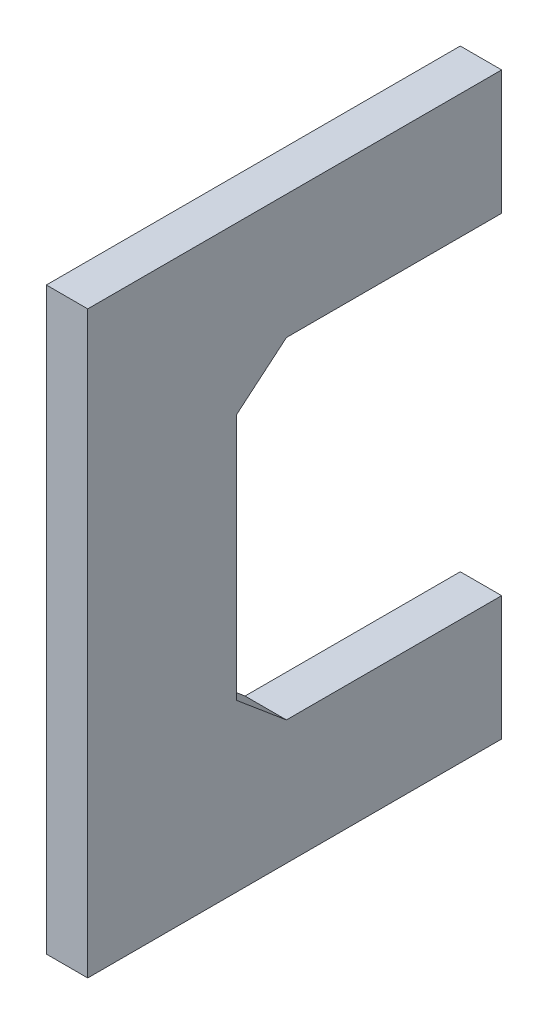
ISO-10303-21;
HEADER;
FILE_DESCRIPTION(('STEP AP214'),'2;1');
FILE_NAME('part.step','',(''),(''),'','','');
FILE_SCHEMA(('AUTOMOTIVE_DESIGN { 1 0 10303 214 1 1 1 1 }'));
ENDSEC;
DATA;
#1=APPLICATION_CONTEXT('core data for automotive mechanical design processes');
#2=APPLICATION_PROTOCOL_DEFINITION('international standard','automotive_design',2000,#1);
#3=PRODUCT_CONTEXT('',#1,'mechanical');
#4=PRODUCT('Part','Part','',(#3));
#5=PRODUCT_RELATED_PRODUCT_CATEGORY('part','',(#4));
#6=PRODUCT_DEFINITION_FORMATION('','',#4);
#7=PRODUCT_DEFINITION_CONTEXT('part definition',#1,'design');
#8=PRODUCT_DEFINITION('design','',#6,#7);
#9=PRODUCT_DEFINITION_SHAPE('','',#8);
#10=(LENGTH_UNIT() NAMED_UNIT(*) SI_UNIT(.MILLI.,.METRE.));
#11=(NAMED_UNIT(*) PLANE_ANGLE_UNIT() SI_UNIT($,.RADIAN.));
#12=(NAMED_UNIT(*) SI_UNIT($,.STERADIAN.) SOLID_ANGLE_UNIT());
#13=UNCERTAINTY_MEASURE_WITH_UNIT(LENGTH_MEASURE(1.E-05),#10,'distance_accuracy_value','');
#14=(GEOMETRIC_REPRESENTATION_CONTEXT(3) GLOBAL_UNCERTAINTY_ASSIGNED_CONTEXT((#13)) GLOBAL_UNIT_ASSIGNED_CONTEXT((#10,
#11,#12)) REPRESENTATION_CONTEXT('',''));
#15=CARTESIAN_POINT('',(0.,0.,0.));
#16=DIRECTION('',(0.,0.,1.));
#17=DIRECTION('',(1.,0.,0.));
#18=AXIS2_PLACEMENT_3D('',#15,#16,#17);
#19=CARTESIAN_POINT('',(5.,0.,-50.));
#20=DIRECTION('',(0.,0.,1.));
#21=DIRECTION('',(1.,0.,0.));
#22=AXIS2_PLACEMENT_3D('',#19,#20,#21);
#23=PLANE('',#22);
#24=DIRECTION('',(0.,1.,0.));
#25=VECTOR('',#24,1.);
#26=CARTESIAN_POINT('',(5.,0.,-50.));
#27=LINE('',#26,#25);
#28=CARTESIAN_POINT('',(5.,55.,-50.));
#29=VERTEX_POINT('',#28);
#30=CARTESIAN_POINT('',(5.,70.,-50.));
#31=VERTEX_POINT('',#30);
#32=EDGE_CURVE('E197',#29,#31,#27,.T.);
#33=ORIENTED_EDGE('',*,*,#32,.F.);
#34=DIRECTION('',(1.,0.,0.));
#35=VECTOR('',#34,1.);
#36=CARTESIAN_POINT('',(0.,55.,-50.));
#37=LINE('',#36,#35);
#38=CARTESIAN_POINT('',(0.,55.,-50.));
#39=VERTEX_POINT('',#38);
#40=EDGE_CURVE('E176',#39,#29,#37,.T.);
#41=ORIENTED_EDGE('',*,*,#40,.F.);
#42=DIRECTION('',(0.,1.,0.));
#43=VECTOR('',#42,1.);
#44=CARTESIAN_POINT('',(0.,0.,-50.));
#45=LINE('',#44,#43);
#46=CARTESIAN_POINT('',(0.,70.,-50.));
#47=VERTEX_POINT('',#46);
#48=EDGE_CURVE('E147',#39,#47,#45,.T.);
#49=ORIENTED_EDGE('',*,*,#48,.T.);
#50=DIRECTION('',(-1.,0.,0.));
#51=VECTOR('',#50,1.);
#52=CARTESIAN_POINT('',(5.,70.,-50.));
#53=LINE('',#52,#51);
#54=EDGE_CURVE('E219',#31,#47,#53,.T.);
#55=ORIENTED_EDGE('',*,*,#54,.F.);
#56=EDGE_LOOP('',(#33,#41,#49,#55));
#57=FACE_BOUND('',#56,.T.);
#58=ADVANCED_FACE('F38',(#57),#23,.F.);
#59=CARTESIAN_POINT('',(5.,0.,0.));
#60=DIRECTION('',(0.,0.,-1.));
#61=DIRECTION('',(-1.,0.,0.));
#62=AXIS2_PLACEMENT_3D('',#59,#60,#61);
#63=PLANE('',#62);
#64=DIRECTION('',(0.,-1.,0.));
#65=VECTOR('',#64,1.);
#66=CARTESIAN_POINT('',(0.,0.,0.));
#67=LINE('',#66,#65);
#68=CARTESIAN_POINT('',(0.,70.,0.));
#69=VERTEX_POINT('',#68);
#70=CARTESIAN_POINT('',(0.,0.,0.));
#71=VERTEX_POINT('',#70);
#72=EDGE_CURVE('E179',#69,#71,#67,.T.);
#73=ORIENTED_EDGE('',*,*,#72,.T.);
#74=DIRECTION('',(-1.,0.,0.));
#75=VECTOR('',#74,1.);
#76=CARTESIAN_POINT('',(5.,0.,0.));
#77=LINE('',#76,#75);
#78=CARTESIAN_POINT('',(5.,0.,0.));
#79=VERTEX_POINT('',#78);
#80=EDGE_CURVE('E11',#79,#71,#77,.T.);
#81=ORIENTED_EDGE('',*,*,#80,.F.);
#82=DIRECTION('',(0.,-1.,0.));
#83=VECTOR('',#82,1.);
#84=CARTESIAN_POINT('',(5.,0.,0.));
#85=LINE('',#84,#83);
#86=CARTESIAN_POINT('',(5.,70.,0.));
#87=VERTEX_POINT('',#86);
#88=EDGE_CURVE('E192',#87,#79,#85,.T.);
#89=ORIENTED_EDGE('',*,*,#88,.F.);
#90=DIRECTION('',(-1.,0.,0.));
#91=VECTOR('',#90,1.);
#92=CARTESIAN_POINT('',(5.,70.,0.));
#93=LINE('',#92,#91);
#94=EDGE_CURVE('E204',#87,#69,#93,.T.);
#95=ORIENTED_EDGE('',*,*,#94,.T.);
#96=EDGE_LOOP('',(#73,#81,#89,#95));
#97=FACE_BOUND('',#96,.T.);
#98=ADVANCED_FACE('F40',(#97),#63,.F.);
#99=CARTESIAN_POINT('',(5.,0.,0.));
#100=DIRECTION('',(0.,1.,0.));
#101=DIRECTION('',(0.,0.,1.));
#102=AXIS2_PLACEMENT_3D('',#99,#100,#101);
#103=PLANE('',#102);
#104=DIRECTION('',(0.,0.,-1.));
#105=VECTOR('',#104,1.);
#106=CARTESIAN_POINT('',(0.,0.,0.));
#107=LINE('',#106,#105);
#108=CARTESIAN_POINT('',(0.,0.,-50.));
#109=VERTEX_POINT('',#108);
#110=EDGE_CURVE('E208',#71,#109,#107,.T.);
#111=ORIENTED_EDGE('',*,*,#110,.T.);
#112=DIRECTION('',(-1.,0.,0.));
#113=VECTOR('',#112,1.);
#114=CARTESIAN_POINT('',(5.,0.,-50.));
#115=LINE('',#114,#113);
#116=CARTESIAN_POINT('',(5.,0.,-50.));
#117=VERTEX_POINT('',#116);
#118=EDGE_CURVE('E47',#117,#109,#115,.T.);
#119=ORIENTED_EDGE('',*,*,#118,.F.);
#120=DIRECTION('',(0.,0.,-1.));
#121=VECTOR('',#120,1.);
#122=CARTESIAN_POINT('',(5.,0.,0.));
#123=LINE('',#122,#121);
#124=EDGE_CURVE('E91',#79,#117,#123,.T.);
#125=ORIENTED_EDGE('',*,*,#124,.F.);
#126=ORIENTED_EDGE('',*,*,#80,.T.);
#127=EDGE_LOOP('',(#111,#119,#125,#126));
#128=FACE_BOUND('',#127,.T.);
#129=ADVANCED_FACE('F238',(#128),#103,.F.);
#130=CARTESIAN_POINT('',(0.,15.,-50.));
#131=VERTEX_POINT('',#130);
#132=EDGE_CURVE('E211',#109,#131,#45,.T.);
#133=ORIENTED_EDGE('',*,*,#132,.T.);
#134=DIRECTION('',(1.,0.,0.));
#135=VECTOR('',#134,1.);
#136=CARTESIAN_POINT('',(0.,15.,-50.));
#137=LINE('',#136,#135);
#138=CARTESIAN_POINT('',(5.,15.,-50.));
#139=VERTEX_POINT('',#138);
#140=EDGE_CURVE('E180',#131,#139,#137,.T.);
#141=ORIENTED_EDGE('',*,*,#140,.T.);
#142=EDGE_CURVE('E198',#117,#139,#27,.T.);
#143=ORIENTED_EDGE('',*,*,#142,.F.);
#144=ORIENTED_EDGE('',*,*,#118,.T.);
#145=EDGE_LOOP('',(#133,#141,#143,#144));
#146=FACE_BOUND('',#145,.T.);
#147=ADVANCED_FACE('F226',(#146),#23,.F.);
#148=CARTESIAN_POINT('',(5.,70.,0.));
#149=DIRECTION('',(0.,-1.,0.));
#150=DIRECTION('',(0.,0.,-1.));
#151=AXIS2_PLACEMENT_3D('',#148,#149,#150);
#152=PLANE('',#151);
#153=DIRECTION('',(0.,0.,1.));
#154=VECTOR('',#153,1.);
#155=CARTESIAN_POINT('',(0.,70.,0.));
#156=LINE('',#155,#154);
#157=EDGE_CURVE('E84',#47,#69,#156,.T.);
#158=ORIENTED_EDGE('',*,*,#157,.T.);
#159=ORIENTED_EDGE('',*,*,#94,.F.);
#160=DIRECTION('',(0.,0.,1.));
#161=VECTOR('',#160,1.);
#162=CARTESIAN_POINT('',(5.,70.,0.));
#163=LINE('',#162,#161);
#164=EDGE_CURVE('E63',#31,#87,#163,.T.);
#165=ORIENTED_EDGE('',*,*,#164,.F.);
#166=ORIENTED_EDGE('',*,*,#54,.T.);
#167=EDGE_LOOP('',(#158,#159,#165,#166));
#168=FACE_BOUND('',#167,.T.);
#169=ADVANCED_FACE('F245',(#168),#152,.F.);
#170=CARTESIAN_POINT('',(5.,0.,0.));
#171=DIRECTION('',(-1.,0.,0.));
#172=DIRECTION('',(0.,0.,1.));
#173=AXIS2_PLACEMENT_3D('',#170,#171,#172);
#174=PLANE('',#173);
#175=DIRECTION('',(0.,-0.64278760968654,0.766044443118977));
#176=VECTOR('',#175,1.);
#177=CARTESIAN_POINT('',(5.,49.9654022129363,-18.));
#178=LINE('',#177,#176);
#179=CARTESIAN_POINT('',(5.,55.,-24.));
#180=VERTEX_POINT('',#179);
#181=CARTESIAN_POINT('',(5.,49.9654022129363,-18.));
#182=VERTEX_POINT('',#181);
#183=EDGE_CURVE('E166',#180,#182,#178,.T.);
#184=ORIENTED_EDGE('',*,*,#183,.F.);
#185=DIRECTION('',(0.,0.,1.));
#186=VECTOR('',#185,1.);
#187=CARTESIAN_POINT('',(5.,55.,-24.));
#188=LINE('',#187,#186);
#189=EDGE_CURVE('E131',#29,#180,#188,.T.);
#190=ORIENTED_EDGE('',*,*,#189,.F.);
#191=ORIENTED_EDGE('',*,*,#32,.T.);
#192=ORIENTED_EDGE('',*,*,#164,.T.);
#193=ORIENTED_EDGE('',*,*,#88,.T.);
#194=ORIENTED_EDGE('',*,*,#124,.T.);
#195=ORIENTED_EDGE('',*,*,#142,.T.);
#196=DIRECTION('',(0.,0.,-1.));
#197=VECTOR('',#196,1.);
#198=CARTESIAN_POINT('',(5.,15.,-24.));
#199=LINE('',#198,#197);
#200=CARTESIAN_POINT('',(5.,15.,-24.));
#201=VERTEX_POINT('',#200);
#202=EDGE_CURVE('E149',#201,#139,#199,.T.);
#203=ORIENTED_EDGE('',*,*,#202,.F.);
#204=DIRECTION('',(0.,-0.64278760968654,-0.766044443118977));
#205=VECTOR('',#204,1.);
#206=CARTESIAN_POINT('',(5.,20.0345977870637,-18.));
#207=LINE('',#206,#205);
#208=CARTESIAN_POINT('',(5.,20.0345977870637,-18.));
#209=VERTEX_POINT('',#208);
#210=EDGE_CURVE('E152',#209,#201,#207,.T.);
#211=ORIENTED_EDGE('',*,*,#210,.F.);
#212=DIRECTION('',(0.,-1.,0.));
#213=VECTOR('',#212,1.);
#214=CARTESIAN_POINT('',(5.,20.0345977870637,-18.));
#215=LINE('',#214,#213);
#216=EDGE_CURVE('E169',#182,#209,#215,.T.);
#217=ORIENTED_EDGE('',*,*,#216,.F.);
#218=EDGE_LOOP('',(#184,#190,#191,#192,#193,#194,#195,#203,#211,#217));
#219=FACE_BOUND('',#218,.T.);
#220=ADVANCED_FACE('F233',(#219),#174,.F.);
#221=CARTESIAN_POINT('',(0.,0.,0.));
#222=DIRECTION('',(-1.,0.,0.));
#223=DIRECTION('',(0.,0.,1.));
#224=AXIS2_PLACEMENT_3D('',#221,#222,#223);
#225=PLANE('',#224);
#226=DIRECTION('',(0.,0.,1.));
#227=VECTOR('',#226,1.);
#228=CARTESIAN_POINT('',(0.,55.,-24.));
#229=LINE('',#228,#227);
#230=CARTESIAN_POINT('',(0.,55.,-24.));
#231=VERTEX_POINT('',#230);
#232=EDGE_CURVE('E128',#39,#231,#229,.T.);
#233=ORIENTED_EDGE('',*,*,#232,.T.);
#234=DIRECTION('',(0.,-0.64278760968654,0.766044443118977));
#235=VECTOR('',#234,1.);
#236=CARTESIAN_POINT('',(0.,49.9654022129363,-18.));
#237=LINE('',#236,#235);
#238=CARTESIAN_POINT('',(0.,49.9654022129363,-18.));
#239=VERTEX_POINT('',#238);
#240=EDGE_CURVE('E140',#231,#239,#237,.T.);
#241=ORIENTED_EDGE('',*,*,#240,.T.);
#242=DIRECTION('',(0.,-1.,0.));
#243=VECTOR('',#242,1.);
#244=CARTESIAN_POINT('',(0.,20.0345977870637,-18.));
#245=LINE('',#244,#243);
#246=CARTESIAN_POINT('',(0.,20.0345977870637,-18.));
#247=VERTEX_POINT('',#246);
#248=EDGE_CURVE('E54',#239,#247,#245,.T.);
#249=ORIENTED_EDGE('',*,*,#248,.T.);
#250=DIRECTION('',(0.,-0.64278760968654,-0.766044443118977));
#251=VECTOR('',#250,1.);
#252=CARTESIAN_POINT('',(0.,20.0345977870637,-18.));
#253=LINE('',#252,#251);
#254=CARTESIAN_POINT('',(0.,15.,-24.));
#255=VERTEX_POINT('',#254);
#256=EDGE_CURVE('E157',#247,#255,#253,.T.);
#257=ORIENTED_EDGE('',*,*,#256,.T.);
#258=DIRECTION('',(0.,0.,-1.));
#259=VECTOR('',#258,1.);
#260=CARTESIAN_POINT('',(0.,15.,-24.));
#261=LINE('',#260,#259);
#262=EDGE_CURVE('E137',#255,#131,#261,.T.);
#263=ORIENTED_EDGE('',*,*,#262,.T.);
#264=ORIENTED_EDGE('',*,*,#132,.F.);
#265=ORIENTED_EDGE('',*,*,#110,.F.);
#266=ORIENTED_EDGE('',*,*,#72,.F.);
#267=ORIENTED_EDGE('',*,*,#157,.F.);
#268=ORIENTED_EDGE('',*,*,#48,.F.);
#269=EDGE_LOOP('',(#233,#241,#249,#257,#263,#264,#265,#266,#267,#268));
#270=FACE_BOUND('',#269,.T.);
#271=ADVANCED_FACE('F146',(#270),#225,.T.);
#272=CARTESIAN_POINT('',(0.,55.,-24.));
#273=DIRECTION('',(0.,1.,0.));
#274=DIRECTION('',(0.,0.,1.));
#275=AXIS2_PLACEMENT_3D('',#272,#273,#274);
#276=PLANE('',#275);
#277=ORIENTED_EDGE('',*,*,#189,.T.);
#278=DIRECTION('',(1.,0.,0.));
#279=VECTOR('',#278,1.);
#280=CARTESIAN_POINT('',(0.,55.,-24.));
#281=LINE('',#280,#279);
#282=EDGE_CURVE('E124',#231,#180,#281,.T.);
#283=ORIENTED_EDGE('',*,*,#282,.F.);
#284=ORIENTED_EDGE('',*,*,#232,.F.);
#285=ORIENTED_EDGE('',*,*,#40,.T.);
#286=EDGE_LOOP('',(#277,#283,#284,#285));
#287=FACE_BOUND('',#286,.T.);
#288=ADVANCED_FACE('F126',(#287),#276,.F.);
#289=CARTESIAN_POINT('',(0.,15.,-24.));
#290=DIRECTION('',(0.,-1.,0.));
#291=DIRECTION('',(0.,0.,-1.));
#292=AXIS2_PLACEMENT_3D('',#289,#290,#291);
#293=PLANE('',#292);
#294=ORIENTED_EDGE('',*,*,#202,.T.);
#295=ORIENTED_EDGE('',*,*,#140,.F.);
#296=ORIENTED_EDGE('',*,*,#262,.F.);
#297=DIRECTION('',(1.,0.,0.));
#298=VECTOR('',#297,1.);
#299=CARTESIAN_POINT('',(0.,15.,-24.));
#300=LINE('',#299,#298);
#301=EDGE_CURVE('E184',#255,#201,#300,.T.);
#302=ORIENTED_EDGE('',*,*,#301,.T.);
#303=EDGE_LOOP('',(#294,#295,#296,#302));
#304=FACE_BOUND('',#303,.T.);
#305=ADVANCED_FACE('F231',(#304),#293,.F.);
#306=CARTESIAN_POINT('',(0.,20.0345977870637,-18.));
#307=DIRECTION('',(0.,-0.766044443118977,0.64278760968654));
#308=DIRECTION('',(0.,-0.64278760968654,-0.766044443118977));
#309=AXIS2_PLACEMENT_3D('',#306,#307,#308);
#310=PLANE('',#309);
#311=ORIENTED_EDGE('',*,*,#210,.T.);
#312=ORIENTED_EDGE('',*,*,#301,.F.);
#313=ORIENTED_EDGE('',*,*,#256,.F.);
#314=DIRECTION('',(1.,0.,0.));
#315=VECTOR('',#314,1.);
#316=CARTESIAN_POINT('',(0.,20.0345977870637,-18.));
#317=LINE('',#316,#315);
#318=EDGE_CURVE('E187',#247,#209,#317,.T.);
#319=ORIENTED_EDGE('',*,*,#318,.T.);
#320=EDGE_LOOP('',(#311,#312,#313,#319));
#321=FACE_BOUND('',#320,.T.);
#322=ADVANCED_FACE('F267',(#321),#310,.F.);
#323=CARTESIAN_POINT('',(0.,20.0345977870637,-18.));
#324=DIRECTION('',(0.,0.,1.));
#325=DIRECTION('',(0.,-1.,0.));
#326=AXIS2_PLACEMENT_3D('',#323,#324,#325);
#327=PLANE('',#326);
#328=ORIENTED_EDGE('',*,*,#216,.T.);
#329=ORIENTED_EDGE('',*,*,#318,.F.);
#330=ORIENTED_EDGE('',*,*,#248,.F.);
#331=DIRECTION('',(1.,0.,0.));
#332=VECTOR('',#331,1.);
#333=CARTESIAN_POINT('',(0.,49.9654022129363,-18.));
#334=LINE('',#333,#332);
#335=EDGE_CURVE('E136',#239,#182,#334,.T.);
#336=ORIENTED_EDGE('',*,*,#335,.T.);
#337=EDGE_LOOP('',(#328,#329,#330,#336));
#338=FACE_BOUND('',#337,.T.);
#339=ADVANCED_FACE('F264',(#338),#327,.F.);
#340=CARTESIAN_POINT('',(0.,49.9654022129363,-18.));
#341=DIRECTION('',(0.,0.766044443118977,0.64278760968654));
#342=DIRECTION('',(0.,-0.64278760968654,0.766044443118977));
#343=AXIS2_PLACEMENT_3D('',#340,#341,#342);
#344=PLANE('',#343);
#345=ORIENTED_EDGE('',*,*,#183,.T.);
#346=ORIENTED_EDGE('',*,*,#335,.F.);
#347=ORIENTED_EDGE('',*,*,#240,.F.);
#348=ORIENTED_EDGE('',*,*,#282,.T.);
#349=EDGE_LOOP('',(#345,#346,#347,#348));
#350=FACE_BOUND('',#349,.T.);
#351=ADVANCED_FACE('F141',(#350),#344,.F.);
#352=CLOSED_SHELL('',(#58,#98,#129,#147,#169,#220,#271,#288,#305,#322,#339,#351));
#353=MANIFOLD_SOLID_BREP('B2',#352);
#354=ADVANCED_BREP_SHAPE_REPRESENTATION('',(#18,#353),#14);
#355=SHAPE_DEFINITION_REPRESENTATION(#9,#354);
ENDSEC;
END-ISO-10303-21;
